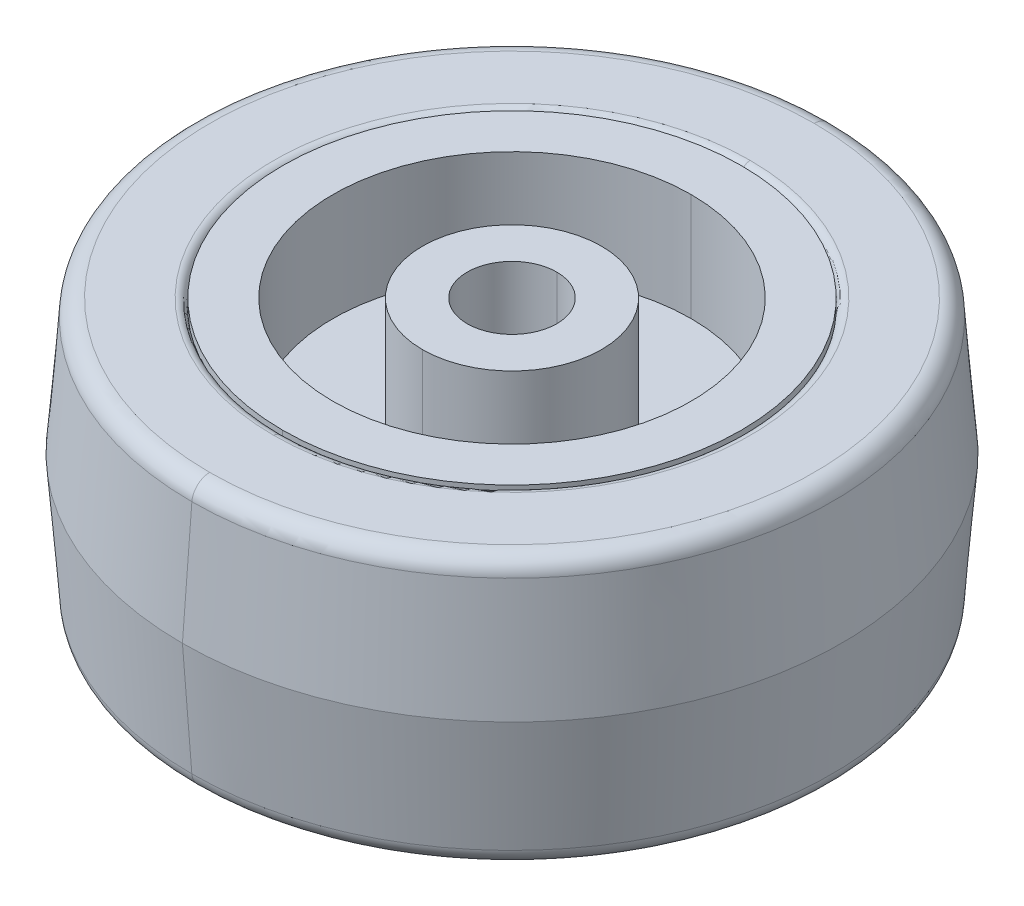
ISO-10303-21;
HEADER;
FILE_DESCRIPTION(('STEP AP214'),'2;1');
FILE_NAME('part.step','',(''),(''),'','','');
FILE_SCHEMA(('AUTOMOTIVE_DESIGN { 1 0 10303 214 1 1 1 1 }'));
ENDSEC;
DATA;
#1=APPLICATION_CONTEXT('core data for automotive mechanical design processes');
#2=APPLICATION_PROTOCOL_DEFINITION('international standard','automotive_design',2000,#1);
#3=PRODUCT_CONTEXT('',#1,'mechanical');
#4=PRODUCT('Part','Part','',(#3));
#5=PRODUCT_RELATED_PRODUCT_CATEGORY('part','',(#4));
#6=PRODUCT_DEFINITION_FORMATION('','',#4);
#7=PRODUCT_DEFINITION_CONTEXT('part definition',#1,'design');
#8=PRODUCT_DEFINITION('design','',#6,#7);
#9=PRODUCT_DEFINITION_SHAPE('','',#8);
#10=(LENGTH_UNIT() NAMED_UNIT(*) SI_UNIT(.MILLI.,.METRE.));
#11=(NAMED_UNIT(*) PLANE_ANGLE_UNIT() SI_UNIT($,.RADIAN.));
#12=(NAMED_UNIT(*) SI_UNIT($,.STERADIAN.) SOLID_ANGLE_UNIT());
#13=UNCERTAINTY_MEASURE_WITH_UNIT(LENGTH_MEASURE(1.E-05),#10,'distance_accuracy_value','');
#14=(GEOMETRIC_REPRESENTATION_CONTEXT(3) GLOBAL_UNCERTAINTY_ASSIGNED_CONTEXT((#13)) GLOBAL_UNIT_ASSIGNED_CONTEXT((#10,
#11,#12)) REPRESENTATION_CONTEXT('',''));
#15=CARTESIAN_POINT('',(0.,0.,0.));
#16=DIRECTION('',(0.,0.,1.));
#17=DIRECTION('',(1.,0.,0.));
#18=AXIS2_PLACEMENT_3D('',#15,#16,#17);
#19=CARTESIAN_POINT('',(16.891,0.,0.));
#20=DIRECTION('',(0.,-1.,0.));
#21=DIRECTION('',(0.,0.,-1.));
#22=AXIS2_PLACEMENT_3D('',#19,#20,#21);
#23=PLANE('',#22);
#24=CARTESIAN_POINT('',(0.,0.,0.));
#25=DIRECTION('',(0.,-1.,0.));
#26=DIRECTION('',(0.,0.,-1.));
#27=AXIS2_PLACEMENT_3D('',#24,#25,#26);
#28=CIRCLE('',#27,16.891);
#29=CARTESIAN_POINT('',(0.,0.,-16.891));
#30=VERTEX_POINT('',#29);
#31=CARTESIAN_POINT('',(0.,0.,16.891));
#32=VERTEX_POINT('',#31);
#33=EDGE_CURVE('E235',#30,#32,#28,.T.);
#34=ORIENTED_EDGE('',*,*,#33,.F.);
#35=CARTESIAN_POINT('',(0.,0.,0.));
#36=DIRECTION('',(0.,-1.,0.));
#37=DIRECTION('',(0.,0.,-1.));
#38=AXIS2_PLACEMENT_3D('',#35,#36,#37);
#39=CIRCLE('',#38,16.891);
#40=EDGE_CURVE('E11',#32,#30,#39,.T.);
#41=ORIENTED_EDGE('',*,*,#40,.F.);
#42=EDGE_LOOP('',(#34,#41));
#43=FACE_BOUND('',#42,.T.);
#44=CARTESIAN_POINT('',(0.,0.,0.));
#45=DIRECTION('',(0.,-1.,0.));
#46=DIRECTION('',(0.,0.,-1.));
#47=AXIS2_PLACEMENT_3D('',#44,#45,#46);
#48=CIRCLE('',#47,21.4335424816752);
#49=CARTESIAN_POINT('',(0.,0.,-21.4335424816752));
#50=VERTEX_POINT('',#49);
#51=CARTESIAN_POINT('',(0.,0.,21.4335424816752));
#52=VERTEX_POINT('',#51);
#53=EDGE_CURVE('E20',#50,#52,#48,.T.);
#54=ORIENTED_EDGE('',*,*,#53,.T.);
#55=CARTESIAN_POINT('',(0.,0.,0.));
#56=DIRECTION('',(0.,-1.,0.));
#57=DIRECTION('',(0.,0.,-1.));
#58=AXIS2_PLACEMENT_3D('',#55,#56,#57);
#59=CIRCLE('',#58,21.4335424816752);
#60=EDGE_CURVE('E311',#52,#50,#59,.T.);
#61=ORIENTED_EDGE('',*,*,#60,.T.);
#62=EDGE_LOOP('',(#54,#61));
#63=FACE_BOUND('',#62,.T.);
#64=ADVANCED_FACE('F16',(#43,#63),#23,.T.);
#65=CARTESIAN_POINT('',(0.,0.635,0.));
#66=DIRECTION('',(0.,-1.,0.));
#67=DIRECTION('',(0.,0.,-1.));
#68=AXIS2_PLACEMENT_3D('',#65,#66,#67);
#69=TOROIDAL_SURFACE('',#68,16.891,0.635);
#70=CARTESIAN_POINT('',(0.,0.635,16.891));
#71=DIRECTION('',(1.,0.,0.));
#72=DIRECTION('',(0.,0.,-1.));
#73=AXIS2_PLACEMENT_3D('',#70,#71,#72);
#74=CIRCLE('',#73,0.635);
#75=CARTESIAN_POINT('',(0.,0.635,16.256));
#76=VERTEX_POINT('',#75);
#77=EDGE_CURVE('E208',#32,#76,#74,.T.);
#78=ORIENTED_EDGE('',*,*,#77,.F.);
#79=ORIENTED_EDGE('',*,*,#40,.T.);
#80=CARTESIAN_POINT('',(0.,0.635,-16.891));
#81=DIRECTION('',(-1.,0.,0.));
#82=DIRECTION('',(0.,0.,1.));
#83=AXIS2_PLACEMENT_3D('',#80,#81,#82);
#84=CIRCLE('',#83,0.635);
#85=CARTESIAN_POINT('',(0.,0.635,-16.256));
#86=VERTEX_POINT('',#85);
#87=EDGE_CURVE('E211',#30,#86,#84,.T.);
#88=ORIENTED_EDGE('',*,*,#87,.T.);
#89=CARTESIAN_POINT('',(0.,0.635,0.));
#90=DIRECTION('',(0.,-1.,0.));
#91=DIRECTION('',(0.,0.,-1.));
#92=AXIS2_PLACEMENT_3D('',#89,#90,#91);
#93=CIRCLE('',#92,16.256);
#94=EDGE_CURVE('E204',#76,#86,#93,.T.);
#95=ORIENTED_EDGE('',*,*,#94,.F.);
#96=EDGE_LOOP('',(#78,#79,#88,#95));
#97=FACE_BOUND('',#96,.T.);
#98=ADVANCED_FACE('F206',(#97),#69,.T.);
#99=CARTESIAN_POINT('',(0.,18.415,0.));
#100=DIRECTION('',(0.,-1.,0.));
#101=DIRECTION('',(0.,0.,-1.));
#102=AXIS2_PLACEMENT_3D('',#99,#100,#101);
#103=TOROIDAL_SURFACE('',#102,16.891,0.635);
#104=CARTESIAN_POINT('',(0.,18.415,16.891));
#105=DIRECTION('',(1.,0.,0.));
#106=DIRECTION('',(0.,0.,-1.));
#107=AXIS2_PLACEMENT_3D('',#104,#105,#106);
#108=CIRCLE('',#107,0.635);
#109=CARTESIAN_POINT('',(0.,18.415,16.256));
#110=VERTEX_POINT('',#109);
#111=CARTESIAN_POINT('',(0.,19.05,16.891));
#112=VERTEX_POINT('',#111);
#113=EDGE_CURVE('E290',#110,#112,#108,.T.);
#114=ORIENTED_EDGE('',*,*,#113,.F.);
#115=CARTESIAN_POINT('',(0.,18.415,0.));
#116=DIRECTION('',(0.,-1.,0.));
#117=DIRECTION('',(0.,0.,-1.));
#118=AXIS2_PLACEMENT_3D('',#115,#116,#117);
#119=CIRCLE('',#118,16.256);
#120=CARTESIAN_POINT('',(0.,18.415,-16.256));
#121=VERTEX_POINT('',#120);
#122=EDGE_CURVE('E246',#110,#121,#119,.T.);
#123=ORIENTED_EDGE('',*,*,#122,.T.);
#124=CARTESIAN_POINT('',(0.,18.415,-16.891));
#125=DIRECTION('',(-1.,0.,0.));
#126=DIRECTION('',(0.,0.,1.));
#127=AXIS2_PLACEMENT_3D('',#124,#125,#126);
#128=CIRCLE('',#127,0.635);
#129=CARTESIAN_POINT('',(0.,19.05,-16.891));
#130=VERTEX_POINT('',#129);
#131=EDGE_CURVE('E268',#121,#130,#128,.T.);
#132=ORIENTED_EDGE('',*,*,#131,.T.);
#133=CARTESIAN_POINT('',(0.,19.05,0.));
#134=DIRECTION('',(0.,-1.,0.));
#135=DIRECTION('',(0.,0.,-1.));
#136=AXIS2_PLACEMENT_3D('',#133,#134,#135);
#137=CIRCLE('',#136,16.891);
#138=EDGE_CURVE('E27',#112,#130,#137,.T.);
#139=ORIENTED_EDGE('',*,*,#138,.F.);
#140=EDGE_LOOP('',(#114,#123,#132,#139));
#141=FACE_BOUND('',#140,.T.);
#142=ADVANCED_FACE('F512',(#141),#103,.T.);
#143=CARTESIAN_POINT('',(16.891,19.05,0.));
#144=DIRECTION('',(0.,1.,0.));
#145=DIRECTION('',(1.,0.,0.));
#146=AXIS2_PLACEMENT_3D('',#143,#144,#145);
#147=PLANE('',#146);
#148=CARTESIAN_POINT('',(0.,19.05,0.));
#149=DIRECTION('',(0.,-1.,0.));
#150=DIRECTION('',(0.,0.,-1.));
#151=AXIS2_PLACEMENT_3D('',#148,#149,#150);
#152=CIRCLE('',#151,16.891);
#153=EDGE_CURVE('E294',#130,#112,#152,.T.);
#154=ORIENTED_EDGE('',*,*,#153,.T.);
#155=ORIENTED_EDGE('',*,*,#138,.T.);
#156=EDGE_LOOP('',(#154,#155));
#157=FACE_BOUND('',#156,.T.);
#158=CARTESIAN_POINT('',(0.,19.05,0.));
#159=DIRECTION('',(0.,-1.,0.));
#160=DIRECTION('',(0.,0.,-1.));
#161=AXIS2_PLACEMENT_3D('',#158,#159,#160);
#162=CIRCLE('',#161,21.4335424816752);
#163=CARTESIAN_POINT('',(0.,19.05,-21.4335424816752));
#164=VERTEX_POINT('',#163);
#165=CARTESIAN_POINT('',(0.,19.05,21.4335424816752));
#166=VERTEX_POINT('',#165);
#167=EDGE_CURVE('E263',#164,#166,#162,.T.);
#168=ORIENTED_EDGE('',*,*,#167,.F.);
#169=CARTESIAN_POINT('',(0.,19.05,0.));
#170=DIRECTION('',(0.,-1.,0.));
#171=DIRECTION('',(0.,0.,-1.));
#172=AXIS2_PLACEMENT_3D('',#169,#170,#171);
#173=CIRCLE('',#172,21.4335424816752);
#174=EDGE_CURVE('E248',#166,#164,#173,.T.);
#175=ORIENTED_EDGE('',*,*,#174,.F.);
#176=EDGE_LOOP('',(#168,#175));
#177=FACE_BOUND('',#176,.T.);
#178=ADVANCED_FACE('F556',(#157,#177),#147,.T.);
#179=CARTESIAN_POINT('',(0.,17.78,0.));
#180=DIRECTION('',(0.,-1.,0.));
#181=DIRECTION('',(0.,0.,-1.));
#182=AXIS2_PLACEMENT_3D('',#179,#180,#181);
#183=TOROIDAL_SURFACE('',#182,21.4335424816752,1.27);
#184=CARTESIAN_POINT('',(0.,17.78,21.4335424816752));
#185=DIRECTION('',(1.,0.,0.));
#186=DIRECTION('',(0.,0.,-1.));
#187=AXIS2_PLACEMENT_3D('',#184,#185,#186);
#188=CIRCLE('',#187,1.27);
#189=CARTESIAN_POINT('',(0.,17.8812764322992,22.699497885416));
#190=VERTEX_POINT('',#189);
#191=EDGE_CURVE('E267',#166,#190,#188,.T.);
#192=ORIENTED_EDGE('',*,*,#191,.F.);
#193=ORIENTED_EDGE('',*,*,#174,.T.);
#194=CARTESIAN_POINT('',(0.,17.78,-21.4335424816752));
#195=DIRECTION('',(-1.,0.,0.));
#196=DIRECTION('',(0.,0.,1.));
#197=AXIS2_PLACEMENT_3D('',#194,#195,#196);
#198=CIRCLE('',#197,1.27);
#199=CARTESIAN_POINT('',(0.,17.8812764322992,-22.699497885416));
#200=VERTEX_POINT('',#199);
#201=EDGE_CURVE('E337',#164,#200,#198,.T.);
#202=ORIENTED_EDGE('',*,*,#201,.T.);
#203=CARTESIAN_POINT('',(0.,17.8812764322992,0.));
#204=DIRECTION('',(0.,-1.,0.));
#205=DIRECTION('',(0.,0.,-1.));
#206=AXIS2_PLACEMENT_3D('',#203,#204,#205);
#207=CIRCLE('',#206,22.699497885416);
#208=EDGE_CURVE('E250',#190,#200,#207,.T.);
#209=ORIENTED_EDGE('',*,*,#208,.F.);
#210=EDGE_LOOP('',(#192,#193,#202,#209));
#211=FACE_BOUND('',#210,.T.);
#212=ADVANCED_FACE('F533',(#211),#183,.T.);
#213=CARTESIAN_POINT('',(0.,9.525,0.));
#214=DIRECTION('',(0.,-1.,0.));
#215=DIRECTION('',(0.,0.,-1.));
#216=AXIS2_PLACEMENT_3D('',#213,#214,#215);
#217=CONICAL_SURFACE('',#216,23.368,0.0798299857122379);
#218=DIRECTION('',(0.,-0.996815278536125,0.07974522228289));
#219=VECTOR('',#218,1.);
#220=CARTESIAN_POINT('',(0.,9.525,23.368));
#221=LINE('',#220,#219);
#222=CARTESIAN_POINT('',(0.,9.525,23.368));
#223=VERTEX_POINT('',#222);
#224=EDGE_CURVE('E333',#190,#223,#221,.T.);
#225=ORIENTED_EDGE('',*,*,#224,.F.);
#226=ORIENTED_EDGE('',*,*,#208,.T.);
#227=DIRECTION('',(0.,-0.996815278536125,-0.07974522228289));
#228=VECTOR('',#227,1.);
#229=CARTESIAN_POINT('',(0.,9.525,-23.368));
#230=LINE('',#229,#228);
#231=CARTESIAN_POINT('',(0.,9.525,-23.368));
#232=VERTEX_POINT('',#231);
#233=EDGE_CURVE('E274',#200,#232,#230,.T.);
#234=ORIENTED_EDGE('',*,*,#233,.T.);
#235=CARTESIAN_POINT('',(0.,9.525,0.));
#236=DIRECTION('',(0.,-1.,0.));
#237=DIRECTION('',(0.,0.,-1.));
#238=AXIS2_PLACEMENT_3D('',#235,#236,#237);
#239=CIRCLE('',#238,23.368);
#240=EDGE_CURVE('E314',#223,#232,#239,.T.);
#241=ORIENTED_EDGE('',*,*,#240,.F.);
#242=EDGE_LOOP('',(#225,#226,#234,#241));
#243=FACE_BOUND('',#242,.T.);
#244=ADVANCED_FACE('F527',(#243),#217,.T.);
#245=CARTESIAN_POINT('',(0.,1.16872356770074,0.));
#246=DIRECTION('',(0.,1.,0.));
#247=DIRECTION('',(0.,0.,1.));
#248=AXIS2_PLACEMENT_3D('',#245,#246,#247);
#249=CONICAL_SURFACE('',#248,22.699497885416,0.0798299857122379);
#250=DIRECTION('',(0.,0.996815278536125,-0.0797452222828901));
#251=VECTOR('',#250,1.);
#252=CARTESIAN_POINT('',(0.,1.16872356770074,-22.699497885416));
#253=LINE('',#252,#251);
#254=CARTESIAN_POINT('',(0.,1.16872356770074,-22.699497885416));
#255=VERTEX_POINT('',#254);
#256=EDGE_CURVE('E273',#255,#232,#253,.T.);
#257=ORIENTED_EDGE('',*,*,#256,.F.);
#258=CARTESIAN_POINT('',(0.,1.16872356770074,0.));
#259=DIRECTION('',(0.,-1.,0.));
#260=DIRECTION('',(0.,0.,-1.));
#261=AXIS2_PLACEMENT_3D('',#258,#259,#260);
#262=CIRCLE('',#261,22.699497885416);
#263=CARTESIAN_POINT('',(0.,1.16872356770074,22.699497885416));
#264=VERTEX_POINT('',#263);
#265=EDGE_CURVE('E315',#264,#255,#262,.T.);
#266=ORIENTED_EDGE('',*,*,#265,.F.);
#267=DIRECTION('',(0.,0.996815278536125,0.0797452222828901));
#268=VECTOR('',#267,1.);
#269=CARTESIAN_POINT('',(0.,1.16872356770074,22.699497885416));
#270=LINE('',#269,#268);
#271=EDGE_CURVE('E371',#264,#223,#270,.T.);
#272=ORIENTED_EDGE('',*,*,#271,.T.);
#273=ORIENTED_EDGE('',*,*,#240,.T.);
#274=EDGE_LOOP('',(#257,#266,#272,#273));
#275=FACE_BOUND('',#274,.T.);
#276=ADVANCED_FACE('F521',(#275),#249,.T.);
#277=CARTESIAN_POINT('',(0.,1.27,0.));
#278=DIRECTION('',(0.,-1.,0.));
#279=DIRECTION('',(0.,0.,-1.));
#280=AXIS2_PLACEMENT_3D('',#277,#278,#279);
#281=TOROIDAL_SURFACE('',#280,21.4335424816752,1.27);
#282=CARTESIAN_POINT('',(0.,1.27,21.4335424816752));
#283=DIRECTION('',(1.,0.,0.));
#284=DIRECTION('',(0.,0.,-1.));
#285=AXIS2_PLACEMENT_3D('',#282,#283,#284);
#286=CIRCLE('',#285,1.27);
#287=EDGE_CURVE('E374',#264,#52,#286,.T.);
#288=ORIENTED_EDGE('',*,*,#287,.F.);
#289=ORIENTED_EDGE('',*,*,#265,.T.);
#290=CARTESIAN_POINT('',(0.,1.27,-21.4335424816752));
#291=DIRECTION('',(-1.,0.,0.));
#292=DIRECTION('',(0.,0.,1.));
#293=AXIS2_PLACEMENT_3D('',#290,#291,#292);
#294=CIRCLE('',#293,1.27);
#295=EDGE_CURVE('E344',#255,#50,#294,.T.);
#296=ORIENTED_EDGE('',*,*,#295,.T.);
#297=ORIENTED_EDGE('',*,*,#60,.F.);
#298=EDGE_LOOP('',(#288,#289,#296,#297));
#299=FACE_BOUND('',#298,.T.);
#300=ADVANCED_FACE('F518',(#299),#281,.T.);
#301=CARTESIAN_POINT('',(0.,0.,0.));
#302=DIRECTION('',(0.,-1.,0.));
#303=DIRECTION('',(0.,0.,-1.));
#304=AXIS2_PLACEMENT_3D('',#301,#302,#303);
#305=CYLINDRICAL_SURFACE('',#304,3.175);
#306=DIRECTION('',(0.,-1.,0.));
#307=VECTOR('',#306,1.);
#308=CARTESIAN_POINT('',(0.,0.,3.175));
#309=LINE('',#308,#307);
#310=CARTESIAN_POINT('',(0.,19.05,3.175));
#311=VERTEX_POINT('',#310);
#312=CARTESIAN_POINT('',(0.,0.,3.175));
#313=VERTEX_POINT('',#312);
#314=EDGE_CURVE('E364',#311,#313,#309,.T.);
#315=ORIENTED_EDGE('',*,*,#314,.F.);
#316=CARTESIAN_POINT('',(0.,19.05,0.));
#317=DIRECTION('',(0.,-1.,0.));
#318=DIRECTION('',(0.,0.,-1.));
#319=AXIS2_PLACEMENT_3D('',#316,#317,#318);
#320=CIRCLE('',#319,3.175);
#321=CARTESIAN_POINT('',(0.,19.05,-3.175));
#322=VERTEX_POINT('',#321);
#323=EDGE_CURVE('E325',#322,#311,#320,.T.);
#324=ORIENTED_EDGE('',*,*,#323,.F.);
#325=DIRECTION('',(0.,-1.,0.));
#326=VECTOR('',#325,1.);
#327=CARTESIAN_POINT('',(0.,0.,-3.175));
#328=LINE('',#327,#326);
#329=CARTESIAN_POINT('',(0.,0.,-3.175));
#330=VERTEX_POINT('',#329);
#331=EDGE_CURVE('E256',#322,#330,#328,.T.);
#332=ORIENTED_EDGE('',*,*,#331,.T.);
#333=CARTESIAN_POINT('',(0.,0.,0.));
#334=DIRECTION('',(0.,-1.,0.));
#335=DIRECTION('',(0.,0.,-1.));
#336=AXIS2_PLACEMENT_3D('',#333,#334,#335);
#337=CIRCLE('',#336,3.175);
#338=EDGE_CURVE('E424',#330,#313,#337,.T.);
#339=ORIENTED_EDGE('',*,*,#338,.T.);
#340=EDGE_LOOP('',(#315,#324,#332,#339));
#341=FACE_BOUND('',#340,.T.);
#342=ADVANCED_FACE('F18',(#341),#305,.F.);
#343=CARTESIAN_POINT('',(3.175,19.05,0.));
#344=DIRECTION('',(0.,1.,0.));
#345=DIRECTION('',(1.,0.,0.));
#346=AXIS2_PLACEMENT_3D('',#343,#344,#345);
#347=PLANE('',#346);
#348=ORIENTED_EDGE('',*,*,#323,.T.);
#349=CARTESIAN_POINT('',(0.,19.05,0.));
#350=DIRECTION('',(0.,-1.,0.));
#351=DIRECTION('',(0.,0.,-1.));
#352=AXIS2_PLACEMENT_3D('',#349,#350,#351);
#353=CIRCLE('',#352,3.175);
#354=EDGE_CURVE('E348',#311,#322,#353,.T.);
#355=ORIENTED_EDGE('',*,*,#354,.T.);
#356=EDGE_LOOP('',(#348,#355));
#357=FACE_BOUND('',#356,.T.);
#358=CARTESIAN_POINT('',(0.,19.05,0.));
#359=DIRECTION('',(0.,-1.,0.));
#360=DIRECTION('',(0.,0.,-1.));
#361=AXIS2_PLACEMENT_3D('',#358,#359,#360);
#362=CIRCLE('',#361,6.35);
#363=CARTESIAN_POINT('',(0.,19.05,-6.35));
#364=VERTEX_POINT('',#363);
#365=CARTESIAN_POINT('',(0.,19.05,6.35));
#366=VERTEX_POINT('',#365);
#367=EDGE_CURVE('E251',#364,#366,#362,.T.);
#368=ORIENTED_EDGE('',*,*,#367,.F.);
#369=CARTESIAN_POINT('',(0.,19.05,0.));
#370=DIRECTION('',(0.,-1.,0.));
#371=DIRECTION('',(0.,0.,-1.));
#372=AXIS2_PLACEMENT_3D('',#369,#370,#371);
#373=CIRCLE('',#372,6.35);
#374=EDGE_CURVE('E398',#366,#364,#373,.T.);
#375=ORIENTED_EDGE('',*,*,#374,.F.);
#376=EDGE_LOOP('',(#368,#375));
#377=FACE_BOUND('',#376,.T.);
#378=ADVANCED_FACE('F610',(#357,#377),#347,.T.);
#379=CARTESIAN_POINT('',(0.,0.,0.));
#380=DIRECTION('',(0.,-1.,0.));
#381=DIRECTION('',(0.,0.,-1.));
#382=AXIS2_PLACEMENT_3D('',#379,#380,#381);
#383=CYLINDRICAL_SURFACE('',#382,6.35);
#384=DIRECTION('',(0.,-1.,0.));
#385=VECTOR('',#384,1.);
#386=CARTESIAN_POINT('',(0.,0.,6.35));
#387=LINE('',#386,#385);
#388=CARTESIAN_POINT('',(0.,11.43,6.35));
#389=VERTEX_POINT('',#388);
#390=EDGE_CURVE('E255',#366,#389,#387,.T.);
#391=ORIENTED_EDGE('',*,*,#390,.F.);
#392=ORIENTED_EDGE('',*,*,#374,.T.);
#393=DIRECTION('',(0.,-1.,0.));
#394=VECTOR('',#393,1.);
#395=CARTESIAN_POINT('',(0.,0.,-6.35));
#396=LINE('',#395,#394);
#397=CARTESIAN_POINT('',(0.,11.43,-6.35));
#398=VERTEX_POINT('',#397);
#399=EDGE_CURVE('E329',#364,#398,#396,.T.);
#400=ORIENTED_EDGE('',*,*,#399,.T.);
#401=CARTESIAN_POINT('',(0.,11.43,0.));
#402=DIRECTION('',(0.,-1.,0.));
#403=DIRECTION('',(0.,0.,-1.));
#404=AXIS2_PLACEMENT_3D('',#401,#402,#403);
#405=CIRCLE('',#404,6.35);
#406=EDGE_CURVE('E284',#389,#398,#405,.T.);
#407=ORIENTED_EDGE('',*,*,#406,.F.);
#408=EDGE_LOOP('',(#391,#392,#400,#407));
#409=FACE_BOUND('',#408,.T.);
#410=ADVANCED_FACE('F550',(#409),#383,.T.);
#411=CARTESIAN_POINT('',(6.35,11.43,0.));
#412=DIRECTION('',(0.,1.,0.));
#413=DIRECTION('',(1.,0.,0.));
#414=AXIS2_PLACEMENT_3D('',#411,#412,#413);
#415=PLANE('',#414);
#416=CARTESIAN_POINT('',(0.,11.43,0.));
#417=DIRECTION('',(0.,-1.,0.));
#418=DIRECTION('',(0.,0.,-1.));
#419=AXIS2_PLACEMENT_3D('',#416,#417,#418);
#420=CIRCLE('',#419,6.35);
#421=EDGE_CURVE('E310',#398,#389,#420,.T.);
#422=ORIENTED_EDGE('',*,*,#421,.T.);
#423=ORIENTED_EDGE('',*,*,#406,.T.);
#424=EDGE_LOOP('',(#422,#423));
#425=FACE_BOUND('',#424,.T.);
#426=CARTESIAN_POINT('',(0.,11.43,0.));
#427=DIRECTION('',(0.,-1.,0.));
#428=DIRECTION('',(0.,0.,-1.));
#429=AXIS2_PLACEMENT_3D('',#426,#427,#428);
#430=CIRCLE('',#429,12.7);
#431=CARTESIAN_POINT('',(0.,11.43,-12.7));
#432=VERTEX_POINT('',#431);
#433=CARTESIAN_POINT('',(0.,11.43,12.7));
#434=VERTEX_POINT('',#433);
#435=EDGE_CURVE('E281',#432,#434,#430,.T.);
#436=ORIENTED_EDGE('',*,*,#435,.F.);
#437=CARTESIAN_POINT('',(0.,11.43,0.));
#438=DIRECTION('',(0.,-1.,0.));
#439=DIRECTION('',(0.,0.,-1.));
#440=AXIS2_PLACEMENT_3D('',#437,#438,#439);
#441=CIRCLE('',#440,12.7);
#442=EDGE_CURVE('E275',#434,#432,#441,.T.);
#443=ORIENTED_EDGE('',*,*,#442,.F.);
#444=EDGE_LOOP('',(#436,#443));
#445=FACE_BOUND('',#444,.T.);
#446=ADVANCED_FACE('F546',(#425,#445),#415,.T.);
#447=CARTESIAN_POINT('',(0.,0.,0.));
#448=DIRECTION('',(0.,-1.,0.));
#449=DIRECTION('',(0.,0.,-1.));
#450=AXIS2_PLACEMENT_3D('',#447,#448,#449);
#451=CYLINDRICAL_SURFACE('',#450,12.7);
#452=DIRECTION('',(0.,-1.,0.));
#453=VECTOR('',#452,1.);
#454=CARTESIAN_POINT('',(0.,0.,12.7));
#455=LINE('',#454,#453);
#456=CARTESIAN_POINT('',(0.,19.05,12.7));
#457=VERTEX_POINT('',#456);
#458=EDGE_CURVE('E280',#457,#434,#455,.T.);
#459=ORIENTED_EDGE('',*,*,#458,.F.);
#460=CARTESIAN_POINT('',(0.,19.05,0.));
#461=DIRECTION('',(0.,-1.,0.));
#462=DIRECTION('',(0.,0.,-1.));
#463=AXIS2_PLACEMENT_3D('',#460,#461,#462);
#464=CIRCLE('',#463,12.7);
#465=CARTESIAN_POINT('',(0.,19.05,-12.7));
#466=VERTEX_POINT('',#465);
#467=EDGE_CURVE('E285',#466,#457,#464,.T.);
#468=ORIENTED_EDGE('',*,*,#467,.F.);
#469=DIRECTION('',(0.,-1.,0.));
#470=VECTOR('',#469,1.);
#471=CARTESIAN_POINT('',(0.,0.,-12.7));
#472=LINE('',#471,#470);
#473=EDGE_CURVE('E279',#466,#432,#472,.T.);
#474=ORIENTED_EDGE('',*,*,#473,.T.);
#475=ORIENTED_EDGE('',*,*,#435,.T.);
#476=EDGE_LOOP('',(#459,#468,#474,#475));
#477=FACE_BOUND('',#476,.T.);
#478=ADVANCED_FACE('F549',(#477),#451,.F.);
#479=CARTESIAN_POINT('',(12.7,19.05,0.));
#480=DIRECTION('',(0.,1.,0.));
#481=DIRECTION('',(1.,0.,0.));
#482=AXIS2_PLACEMENT_3D('',#479,#480,#481);
#483=PLANE('',#482);
#484=ORIENTED_EDGE('',*,*,#467,.T.);
#485=CARTESIAN_POINT('',(0.,19.05,0.));
#486=DIRECTION('',(0.,-1.,0.));
#487=DIRECTION('',(0.,0.,-1.));
#488=AXIS2_PLACEMENT_3D('',#485,#486,#487);
#489=CIRCLE('',#488,12.7);
#490=EDGE_CURVE('E306',#457,#466,#489,.T.);
#491=ORIENTED_EDGE('',*,*,#490,.T.);
#492=EDGE_LOOP('',(#484,#491));
#493=FACE_BOUND('',#492,.T.);
#494=CARTESIAN_POINT('',(0.,19.05,0.));
#495=DIRECTION('',(0.,-1.,0.));
#496=DIRECTION('',(0.,0.,-1.));
#497=AXIS2_PLACEMENT_3D('',#494,#495,#496);
#498=CIRCLE('',#497,16.256);
#499=CARTESIAN_POINT('',(0.,19.05,-16.256));
#500=VERTEX_POINT('',#499);
#501=CARTESIAN_POINT('',(0.,19.05,16.256));
#502=VERTEX_POINT('',#501);
#503=EDGE_CURVE('E296',#500,#502,#498,.T.);
#504=ORIENTED_EDGE('',*,*,#503,.F.);
#505=CARTESIAN_POINT('',(0.,19.05,0.));
#506=DIRECTION('',(0.,-1.,0.));
#507=DIRECTION('',(0.,0.,-1.));
#508=AXIS2_PLACEMENT_3D('',#505,#506,#507);
#509=CIRCLE('',#508,16.256);
#510=EDGE_CURVE('E321',#502,#500,#509,.T.);
#511=ORIENTED_EDGE('',*,*,#510,.F.);
#512=EDGE_LOOP('',(#504,#511));
#513=FACE_BOUND('',#512,.T.);
#514=ADVANCED_FACE('F501',(#493,#513),#483,.T.);
#515=CARTESIAN_POINT('',(0.,0.,0.));
#516=DIRECTION('',(0.,-1.,0.));
#517=DIRECTION('',(0.,0.,-1.));
#518=AXIS2_PLACEMENT_3D('',#515,#516,#517);
#519=CYLINDRICAL_SURFACE('',#518,16.256);
#520=DIRECTION('',(0.,-1.,0.));
#521=VECTOR('',#520,1.);
#522=CARTESIAN_POINT('',(0.,0.,16.256));
#523=LINE('',#522,#521);
#524=EDGE_CURVE('E300',#502,#110,#523,.T.);
#525=ORIENTED_EDGE('',*,*,#524,.F.);
#526=ORIENTED_EDGE('',*,*,#510,.T.);
#527=DIRECTION('',(0.,-1.,0.));
#528=VECTOR('',#527,1.);
#529=CARTESIAN_POINT('',(0.,0.,-16.256));
#530=LINE('',#529,#528);
#531=EDGE_CURVE('E409',#500,#121,#530,.T.);
#532=ORIENTED_EDGE('',*,*,#531,.T.);
#533=ORIENTED_EDGE('',*,*,#122,.F.);
#534=EDGE_LOOP('',(#525,#526,#532,#533));
#535=FACE_BOUND('',#534,.T.);
#536=ADVANCED_FACE('F493',(#535),#519,.T.);
#537=CARTESIAN_POINT('',(12.7,0.,0.));
#538=DIRECTION('',(0.,-1.,0.));
#539=DIRECTION('',(0.,0.,-1.));
#540=AXIS2_PLACEMENT_3D('',#537,#538,#539);
#541=PLANE('',#540);
#542=CARTESIAN_POINT('',(0.,0.,0.));
#543=DIRECTION('',(0.,-1.,0.));
#544=DIRECTION('',(0.,0.,-1.));
#545=AXIS2_PLACEMENT_3D('',#542,#543,#544);
#546=CIRCLE('',#545,12.7);
#547=CARTESIAN_POINT('',(0.,0.,-12.7));
#548=VERTEX_POINT('',#547);
#549=CARTESIAN_POINT('',(0.,0.,12.7));
#550=VERTEX_POINT('',#549);
#551=EDGE_CURVE('E318',#548,#550,#546,.T.);
#552=ORIENTED_EDGE('',*,*,#551,.F.);
#553=CARTESIAN_POINT('',(0.,0.,0.));
#554=DIRECTION('',(0.,-1.,0.));
#555=DIRECTION('',(0.,0.,-1.));
#556=AXIS2_PLACEMENT_3D('',#553,#554,#555);
#557=CIRCLE('',#556,12.7);
#558=EDGE_CURVE('E261',#550,#548,#557,.T.);
#559=ORIENTED_EDGE('',*,*,#558,.F.);
#560=EDGE_LOOP('',(#552,#559));
#561=FACE_BOUND('',#560,.T.);
#562=CARTESIAN_POINT('',(0.,0.,0.));
#563=DIRECTION('',(0.,-1.,0.));
#564=DIRECTION('',(0.,0.,-1.));
#565=AXIS2_PLACEMENT_3D('',#562,#563,#564);
#566=CIRCLE('',#565,16.256);
#567=CARTESIAN_POINT('',(0.,0.,-16.256));
#568=VERTEX_POINT('',#567);
#569=CARTESIAN_POINT('',(0.,0.,16.256));
#570=VERTEX_POINT('',#569);
#571=EDGE_CURVE('E225',#568,#570,#566,.T.);
#572=ORIENTED_EDGE('',*,*,#571,.T.);
#573=CARTESIAN_POINT('',(0.,0.,0.));
#574=DIRECTION('',(0.,-1.,0.));
#575=DIRECTION('',(0.,0.,-1.));
#576=AXIS2_PLACEMENT_3D('',#573,#574,#575);
#577=CIRCLE('',#576,16.256);
#578=EDGE_CURVE('E40',#570,#568,#577,.T.);
#579=ORIENTED_EDGE('',*,*,#578,.T.);
#580=EDGE_LOOP('',(#572,#579));
#581=FACE_BOUND('',#580,.T.);
#582=ADVANCED_FACE('F491',(#561,#581),#541,.T.);
#583=CARTESIAN_POINT('',(0.,0.,0.));
#584=DIRECTION('',(0.,-1.,0.));
#585=DIRECTION('',(0.,0.,-1.));
#586=AXIS2_PLACEMENT_3D('',#583,#584,#585);
#587=CYLINDRICAL_SURFACE('',#586,12.7);
#588=DIRECTION('',(0.,-1.,0.));
#589=VECTOR('',#588,1.);
#590=CARTESIAN_POINT('',(0.,0.,12.7));
#591=LINE('',#590,#589);
#592=CARTESIAN_POINT('',(0.,7.62,12.7));
#593=VERTEX_POINT('',#592);
#594=EDGE_CURVE('E257',#593,#550,#591,.T.);
#595=ORIENTED_EDGE('',*,*,#594,.F.);
#596=CARTESIAN_POINT('',(0.,7.62,0.));
#597=DIRECTION('',(0.,-1.,0.));
#598=DIRECTION('',(0.,0.,-1.));
#599=AXIS2_PLACEMENT_3D('',#596,#597,#598);
#600=CIRCLE('',#599,12.7);
#601=CARTESIAN_POINT('',(0.,7.62,-12.7));
#602=VERTEX_POINT('',#601);
#603=EDGE_CURVE('E322',#602,#593,#600,.T.);
#604=ORIENTED_EDGE('',*,*,#603,.F.);
#605=DIRECTION('',(0.,-1.,0.));
#606=VECTOR('',#605,1.);
#607=CARTESIAN_POINT('',(0.,0.,-12.7));
#608=LINE('',#607,#606);
#609=EDGE_CURVE('E356',#602,#548,#608,.T.);
#610=ORIENTED_EDGE('',*,*,#609,.T.);
#611=ORIENTED_EDGE('',*,*,#551,.T.);
#612=EDGE_LOOP('',(#595,#604,#610,#611));
#613=FACE_BOUND('',#612,.T.);
#614=ADVANCED_FACE('F481',(#613),#587,.F.);
#615=CARTESIAN_POINT('',(6.35,7.62,0.));
#616=DIRECTION('',(0.,-1.,0.));
#617=DIRECTION('',(0.,0.,-1.));
#618=AXIS2_PLACEMENT_3D('',#615,#616,#617);
#619=PLANE('',#618);
#620=CARTESIAN_POINT('',(0.,7.62,0.));
#621=DIRECTION('',(0.,-1.,0.));
#622=DIRECTION('',(0.,0.,-1.));
#623=AXIS2_PLACEMENT_3D('',#620,#621,#622);
#624=CIRCLE('',#623,6.35);
#625=CARTESIAN_POINT('',(0.,7.62,-6.35));
#626=VERTEX_POINT('',#625);
#627=CARTESIAN_POINT('',(0.,7.62,6.35));
#628=VERTEX_POINT('',#627);
#629=EDGE_CURVE('E351',#626,#628,#624,.T.);
#630=ORIENTED_EDGE('',*,*,#629,.F.);
#631=CARTESIAN_POINT('',(0.,7.62,0.));
#632=DIRECTION('',(0.,-1.,0.));
#633=DIRECTION('',(0.,0.,-1.));
#634=AXIS2_PLACEMENT_3D('',#631,#632,#633);
#635=CIRCLE('',#634,6.35);
#636=EDGE_CURVE('E452',#628,#626,#635,.T.);
#637=ORIENTED_EDGE('',*,*,#636,.F.);
#638=EDGE_LOOP('',(#630,#637));
#639=FACE_BOUND('',#638,.T.);
#640=ORIENTED_EDGE('',*,*,#603,.T.);
#641=CARTESIAN_POINT('',(0.,7.62,0.));
#642=DIRECTION('',(0.,-1.,0.));
#643=DIRECTION('',(0.,0.,-1.));
#644=AXIS2_PLACEMENT_3D('',#641,#642,#643);
#645=CIRCLE('',#644,12.7);
#646=EDGE_CURVE('E262',#593,#602,#645,.T.);
#647=ORIENTED_EDGE('',*,*,#646,.T.);
#648=EDGE_LOOP('',(#640,#647));
#649=FACE_BOUND('',#648,.T.);
#650=ADVANCED_FACE('F478',(#639,#649),#619,.T.);
#651=CARTESIAN_POINT('',(0.,0.,0.));
#652=DIRECTION('',(0.,-1.,0.));
#653=DIRECTION('',(0.,0.,-1.));
#654=AXIS2_PLACEMENT_3D('',#651,#652,#653);
#655=CYLINDRICAL_SURFACE('',#654,6.35);
#656=DIRECTION('',(0.,-1.,0.));
#657=VECTOR('',#656,1.);
#658=CARTESIAN_POINT('',(0.,0.,6.35));
#659=LINE('',#658,#657);
#660=CARTESIAN_POINT('',(0.,0.,6.35));
#661=VERTEX_POINT('',#660);
#662=EDGE_CURVE('E355',#628,#661,#659,.T.);
#663=ORIENTED_EDGE('',*,*,#662,.F.);
#664=ORIENTED_EDGE('',*,*,#636,.T.);
#665=DIRECTION('',(0.,-1.,0.));
#666=VECTOR('',#665,1.);
#667=CARTESIAN_POINT('',(0.,0.,-6.35));
#668=LINE('',#667,#666);
#669=CARTESIAN_POINT('',(0.,0.,-6.35));
#670=VERTEX_POINT('',#669);
#671=EDGE_CURVE('E226',#626,#670,#668,.T.);
#672=ORIENTED_EDGE('',*,*,#671,.T.);
#673=CARTESIAN_POINT('',(0.,0.,0.));
#674=DIRECTION('',(0.,-1.,0.));
#675=DIRECTION('',(0.,0.,-1.));
#676=AXIS2_PLACEMENT_3D('',#673,#674,#675);
#677=CIRCLE('',#676,6.35);
#678=EDGE_CURVE('E421',#661,#670,#677,.T.);
#679=ORIENTED_EDGE('',*,*,#678,.F.);
#680=EDGE_LOOP('',(#663,#664,#672,#679));
#681=FACE_BOUND('',#680,.T.);
#682=ADVANCED_FACE('F472',(#681),#655,.T.);
#683=CARTESIAN_POINT('',(3.175,0.,0.));
#684=DIRECTION('',(0.,-1.,0.));
#685=DIRECTION('',(0.,0.,-1.));
#686=AXIS2_PLACEMENT_3D('',#683,#684,#685);
#687=PLANE('',#686);
#688=ORIENTED_EDGE('',*,*,#338,.F.);
#689=CARTESIAN_POINT('',(0.,0.,0.));
#690=DIRECTION('',(0.,-1.,0.));
#691=DIRECTION('',(0.,0.,-1.));
#692=AXIS2_PLACEMENT_3D('',#689,#690,#691);
#693=CIRCLE('',#692,3.175);
#694=EDGE_CURVE('E360',#313,#330,#693,.T.);
#695=ORIENTED_EDGE('',*,*,#694,.F.);
#696=EDGE_LOOP('',(#688,#695));
#697=FACE_BOUND('',#696,.T.);
#698=CARTESIAN_POINT('',(0.,0.,0.));
#699=DIRECTION('',(0.,-1.,0.));
#700=DIRECTION('',(0.,0.,-1.));
#701=AXIS2_PLACEMENT_3D('',#698,#699,#700);
#702=CIRCLE('',#701,6.35);
#703=EDGE_CURVE('E289',#670,#661,#702,.T.);
#704=ORIENTED_EDGE('',*,*,#703,.T.);
#705=ORIENTED_EDGE('',*,*,#678,.T.);
#706=EDGE_LOOP('',(#704,#705));
#707=FACE_BOUND('',#706,.T.);
#708=ADVANCED_FACE('F530',(#697,#707),#687,.T.);
#709=CARTESIAN_POINT('',(0.,0.,0.));
#710=DIRECTION('',(0.,-1.,0.));
#711=DIRECTION('',(0.,0.,-1.));
#712=AXIS2_PLACEMENT_3D('',#709,#710,#711);
#713=CYLINDRICAL_SURFACE('',#712,16.256);
#714=DIRECTION('',(0.,-1.,0.));
#715=VECTOR('',#714,1.);
#716=CARTESIAN_POINT('',(0.,0.,16.256));
#717=LINE('',#716,#715);
#718=EDGE_CURVE('E219',#76,#570,#717,.T.);
#719=ORIENTED_EDGE('',*,*,#718,.F.);
#720=ORIENTED_EDGE('',*,*,#94,.T.);
#721=DIRECTION('',(0.,-1.,0.));
#722=VECTOR('',#721,1.);
#723=CARTESIAN_POINT('',(0.,0.,-16.256));
#724=LINE('',#723,#722);
#725=EDGE_CURVE('E216',#86,#568,#724,.T.);
#726=ORIENTED_EDGE('',*,*,#725,.T.);
#727=ORIENTED_EDGE('',*,*,#578,.F.);
#728=EDGE_LOOP('',(#719,#720,#726,#727));
#729=FACE_BOUND('',#728,.T.);
#730=ADVANCED_FACE('F221',(#729),#713,.T.);
#731=CARTESIAN_POINT('',(0.,0.,0.));
#732=DIRECTION('',(0.,-1.,0.));
#733=DIRECTION('',(0.,0.,-1.));
#734=AXIS2_PLACEMENT_3D('',#731,#732,#733);
#735=CYLINDRICAL_SURFACE('',#734,16.256);
#736=CARTESIAN_POINT('',(0.,0.635,0.));
#737=DIRECTION('',(0.,-1.,0.));
#738=DIRECTION('',(0.,0.,-1.));
#739=AXIS2_PLACEMENT_3D('',#736,#737,#738);
#740=CIRCLE('',#739,16.256);
#741=EDGE_CURVE('E228',#86,#76,#740,.T.);
#742=ORIENTED_EDGE('',*,*,#741,.T.);
#743=ORIENTED_EDGE('',*,*,#718,.T.);
#744=ORIENTED_EDGE('',*,*,#571,.F.);
#745=ORIENTED_EDGE('',*,*,#725,.F.);
#746=EDGE_LOOP('',(#742,#743,#744,#745));
#747=FACE_BOUND('',#746,.T.);
#748=ADVANCED_FACE('F229',(#747),#735,.T.);
#749=CARTESIAN_POINT('',(0.,0.,0.));
#750=DIRECTION('',(0.,-1.,0.));
#751=DIRECTION('',(0.,0.,-1.));
#752=AXIS2_PLACEMENT_3D('',#749,#750,#751);
#753=CYLINDRICAL_SURFACE('',#752,6.35);
#754=ORIENTED_EDGE('',*,*,#629,.T.);
#755=ORIENTED_EDGE('',*,*,#662,.T.);
#756=ORIENTED_EDGE('',*,*,#703,.F.);
#757=ORIENTED_EDGE('',*,*,#671,.F.);
#758=EDGE_LOOP('',(#754,#755,#756,#757));
#759=FACE_BOUND('',#758,.T.);
#760=ADVANCED_FACE('F477',(#759),#753,.T.);
#761=CARTESIAN_POINT('',(0.,0.,0.));
#762=DIRECTION('',(0.,-1.,0.));
#763=DIRECTION('',(0.,0.,-1.));
#764=AXIS2_PLACEMENT_3D('',#761,#762,#763);
#765=CYLINDRICAL_SURFACE('',#764,12.7);
#766=ORIENTED_EDGE('',*,*,#646,.F.);
#767=ORIENTED_EDGE('',*,*,#594,.T.);
#768=ORIENTED_EDGE('',*,*,#558,.T.);
#769=ORIENTED_EDGE('',*,*,#609,.F.);
#770=EDGE_LOOP('',(#766,#767,#768,#769));
#771=FACE_BOUND('',#770,.T.);
#772=ADVANCED_FACE('F489',(#771),#765,.F.);
#773=CARTESIAN_POINT('',(0.,0.,0.));
#774=DIRECTION('',(0.,-1.,0.));
#775=DIRECTION('',(0.,0.,-1.));
#776=AXIS2_PLACEMENT_3D('',#773,#774,#775);
#777=CYLINDRICAL_SURFACE('',#776,16.256);
#778=ORIENTED_EDGE('',*,*,#503,.T.);
#779=ORIENTED_EDGE('',*,*,#524,.T.);
#780=CARTESIAN_POINT('',(0.,18.415,0.));
#781=DIRECTION('',(0.,-1.,0.));
#782=DIRECTION('',(0.,0.,-1.));
#783=AXIS2_PLACEMENT_3D('',#780,#781,#782);
#784=CIRCLE('',#783,16.256);
#785=EDGE_CURVE('E295',#121,#110,#784,.T.);
#786=ORIENTED_EDGE('',*,*,#785,.F.);
#787=ORIENTED_EDGE('',*,*,#531,.F.);
#788=EDGE_LOOP('',(#778,#779,#786,#787));
#789=FACE_BOUND('',#788,.T.);
#790=ADVANCED_FACE('F537',(#789),#777,.T.);
#791=CARTESIAN_POINT('',(0.,0.,0.));
#792=DIRECTION('',(0.,-1.,0.));
#793=DIRECTION('',(0.,0.,-1.));
#794=AXIS2_PLACEMENT_3D('',#791,#792,#793);
#795=CYLINDRICAL_SURFACE('',#794,12.7);
#796=ORIENTED_EDGE('',*,*,#490,.F.);
#797=ORIENTED_EDGE('',*,*,#458,.T.);
#798=ORIENTED_EDGE('',*,*,#442,.T.);
#799=ORIENTED_EDGE('',*,*,#473,.F.);
#800=EDGE_LOOP('',(#796,#797,#798,#799));
#801=FACE_BOUND('',#800,.T.);
#802=ADVANCED_FACE('F552',(#801),#795,.F.);
#803=CARTESIAN_POINT('',(0.,0.,0.));
#804=DIRECTION('',(0.,-1.,0.));
#805=DIRECTION('',(0.,0.,-1.));
#806=AXIS2_PLACEMENT_3D('',#803,#804,#805);
#807=CYLINDRICAL_SURFACE('',#806,6.35);
#808=ORIENTED_EDGE('',*,*,#367,.T.);
#809=ORIENTED_EDGE('',*,*,#390,.T.);
#810=ORIENTED_EDGE('',*,*,#421,.F.);
#811=ORIENTED_EDGE('',*,*,#399,.F.);
#812=EDGE_LOOP('',(#808,#809,#810,#811));
#813=FACE_BOUND('',#812,.T.);
#814=ADVANCED_FACE('F554',(#813),#807,.T.);
#815=CARTESIAN_POINT('',(0.,0.,0.));
#816=DIRECTION('',(0.,-1.,0.));
#817=DIRECTION('',(0.,0.,-1.));
#818=AXIS2_PLACEMENT_3D('',#815,#816,#817);
#819=CYLINDRICAL_SURFACE('',#818,3.175);
#820=ORIENTED_EDGE('',*,*,#354,.F.);
#821=ORIENTED_EDGE('',*,*,#314,.T.);
#822=ORIENTED_EDGE('',*,*,#694,.T.);
#823=ORIENTED_EDGE('',*,*,#331,.F.);
#824=EDGE_LOOP('',(#820,#821,#822,#823));
#825=FACE_BOUND('',#824,.T.);
#826=ADVANCED_FACE('F517',(#825),#819,.F.);
#827=CARTESIAN_POINT('',(0.,1.27,0.));
#828=DIRECTION('',(0.,-1.,0.));
#829=DIRECTION('',(0.,0.,-1.));
#830=AXIS2_PLACEMENT_3D('',#827,#828,#829);
#831=TOROIDAL_SURFACE('',#830,21.4335424816752,1.27);
#832=CARTESIAN_POINT('',(0.,1.16872356770074,0.));
#833=DIRECTION('',(0.,-1.,0.));
#834=DIRECTION('',(0.,0.,-1.));
#835=AXIS2_PLACEMENT_3D('',#832,#833,#834);
#836=CIRCLE('',#835,22.699497885416);
#837=EDGE_CURVE('E269',#255,#264,#836,.T.);
#838=ORIENTED_EDGE('',*,*,#837,.T.);
#839=ORIENTED_EDGE('',*,*,#287,.T.);
#840=ORIENTED_EDGE('',*,*,#53,.F.);
#841=ORIENTED_EDGE('',*,*,#295,.F.);
#842=EDGE_LOOP('',(#838,#839,#840,#841));
#843=FACE_BOUND('',#842,.T.);
#844=ADVANCED_FACE('F578',(#843),#831,.T.);
#845=CARTESIAN_POINT('',(0.,1.16872356770074,0.));
#846=DIRECTION('',(0.,1.,0.));
#847=DIRECTION('',(0.,0.,1.));
#848=AXIS2_PLACEMENT_3D('',#845,#846,#847);
#849=CONICAL_SURFACE('',#848,22.699497885416,0.0798299857122379);
#850=ORIENTED_EDGE('',*,*,#837,.F.);
#851=ORIENTED_EDGE('',*,*,#256,.T.);
#852=CARTESIAN_POINT('',(0.,9.525,0.));
#853=DIRECTION('',(0.,-1.,0.));
#854=DIRECTION('',(0.,0.,-1.));
#855=AXIS2_PLACEMENT_3D('',#852,#853,#854);
#856=CIRCLE('',#855,23.368);
#857=EDGE_CURVE('E336',#232,#223,#856,.T.);
#858=ORIENTED_EDGE('',*,*,#857,.T.);
#859=ORIENTED_EDGE('',*,*,#271,.F.);
#860=EDGE_LOOP('',(#850,#851,#858,#859));
#861=FACE_BOUND('',#860,.T.);
#862=ADVANCED_FACE('F544',(#861),#849,.T.);
#863=CARTESIAN_POINT('',(0.,9.525,0.));
#864=DIRECTION('',(0.,-1.,0.));
#865=DIRECTION('',(0.,0.,-1.));
#866=AXIS2_PLACEMENT_3D('',#863,#864,#865);
#867=CONICAL_SURFACE('',#866,23.368,0.0798299857122379);
#868=CARTESIAN_POINT('',(0.,17.8812764322992,0.));
#869=DIRECTION('',(0.,-1.,0.));
#870=DIRECTION('',(0.,0.,-1.));
#871=AXIS2_PLACEMENT_3D('',#868,#869,#870);
#872=CIRCLE('',#871,22.699497885416);
#873=EDGE_CURVE('E368',#200,#190,#872,.T.);
#874=ORIENTED_EDGE('',*,*,#873,.T.);
#875=ORIENTED_EDGE('',*,*,#224,.T.);
#876=ORIENTED_EDGE('',*,*,#857,.F.);
#877=ORIENTED_EDGE('',*,*,#233,.F.);
#878=EDGE_LOOP('',(#874,#875,#876,#877));
#879=FACE_BOUND('',#878,.T.);
#880=ADVANCED_FACE('F540',(#879),#867,.T.);
#881=CARTESIAN_POINT('',(0.,17.78,0.));
#882=DIRECTION('',(0.,-1.,0.));
#883=DIRECTION('',(0.,0.,-1.));
#884=AXIS2_PLACEMENT_3D('',#881,#882,#883);
#885=TOROIDAL_SURFACE('',#884,21.4335424816752,1.27);
#886=ORIENTED_EDGE('',*,*,#167,.T.);
#887=ORIENTED_EDGE('',*,*,#191,.T.);
#888=ORIENTED_EDGE('',*,*,#873,.F.);
#889=ORIENTED_EDGE('',*,*,#201,.F.);
#890=EDGE_LOOP('',(#886,#887,#888,#889));
#891=FACE_BOUND('',#890,.T.);
#892=ADVANCED_FACE('F543',(#891),#885,.T.);
#893=CARTESIAN_POINT('',(0.,18.415,0.));
#894=DIRECTION('',(0.,-1.,0.));
#895=DIRECTION('',(0.,0.,-1.));
#896=AXIS2_PLACEMENT_3D('',#893,#894,#895);
#897=TOROIDAL_SURFACE('',#896,16.891,0.635);
#898=ORIENTED_EDGE('',*,*,#785,.T.);
#899=ORIENTED_EDGE('',*,*,#113,.T.);
#900=ORIENTED_EDGE('',*,*,#153,.F.);
#901=ORIENTED_EDGE('',*,*,#131,.F.);
#902=EDGE_LOOP('',(#898,#899,#900,#901));
#903=FACE_BOUND('',#902,.T.);
#904=ADVANCED_FACE('F627',(#903),#897,.T.);
#905=CARTESIAN_POINT('',(0.,0.635,0.));
#906=DIRECTION('',(0.,-1.,0.));
#907=DIRECTION('',(0.,0.,-1.));
#908=AXIS2_PLACEMENT_3D('',#905,#906,#907);
#909=TOROIDAL_SURFACE('',#908,16.891,0.635);
#910=ORIENTED_EDGE('',*,*,#33,.T.);
#911=ORIENTED_EDGE('',*,*,#77,.T.);
#912=ORIENTED_EDGE('',*,*,#741,.F.);
#913=ORIENTED_EDGE('',*,*,#87,.F.);
#914=EDGE_LOOP('',(#910,#911,#912,#913));
#915=FACE_BOUND('',#914,.T.);
#916=ADVANCED_FACE('F233',(#915),#909,.T.);
#917=CLOSED_SHELL('',(#64,#98,#142,#178,#212,#244,#276,#300,#342,#378,#410,#446,#478,#514,#536,
#582,#614,#650,#682,#708,#730,#748,#760,#772,#790,#802,#814,#826,#844,#862,#880,#892,#904,#916));
#918=MANIFOLD_SOLID_BREP('B1',#917);
#919=ADVANCED_BREP_SHAPE_REPRESENTATION('',(#18,#918),#14);
#920=SHAPE_DEFINITION_REPRESENTATION(#9,#919);
ENDSEC;
END-ISO-10303-21;
